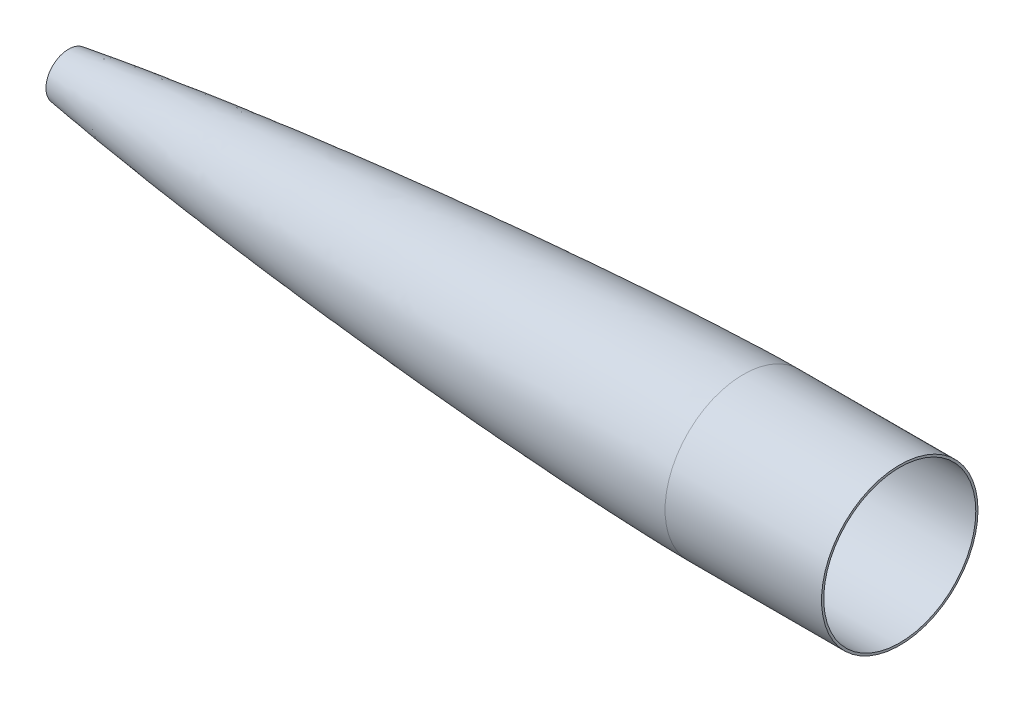
ISO-10303-21;
HEADER;
FILE_DESCRIPTION(('STEP AP214'),'2;1');
FILE_NAME('part.step','',(''),(''),'','','');
FILE_SCHEMA(('AUTOMOTIVE_DESIGN { 1 0 10303 214 1 1 1 1 }'));
ENDSEC;
DATA;
#1=APPLICATION_CONTEXT('core data for automotive mechanical design processes');
#2=APPLICATION_PROTOCOL_DEFINITION('international standard','automotive_design',2000,#1);
#3=PRODUCT_CONTEXT('',#1,'mechanical');
#4=PRODUCT('Part','Part','',(#3));
#5=PRODUCT_RELATED_PRODUCT_CATEGORY('part','',(#4));
#6=PRODUCT_DEFINITION_FORMATION('','',#4);
#7=PRODUCT_DEFINITION_CONTEXT('part definition',#1,'design');
#8=PRODUCT_DEFINITION('design','',#6,#7);
#9=PRODUCT_DEFINITION_SHAPE('','',#8);
#10=(LENGTH_UNIT() NAMED_UNIT(*) SI_UNIT(.MILLI.,.METRE.));
#11=(NAMED_UNIT(*) PLANE_ANGLE_UNIT() SI_UNIT($,.RADIAN.));
#12=(NAMED_UNIT(*) SI_UNIT($,.STERADIAN.) SOLID_ANGLE_UNIT());
#13=UNCERTAINTY_MEASURE_WITH_UNIT(LENGTH_MEASURE(1.E-05),#10,'distance_accuracy_value','');
#14=(GEOMETRIC_REPRESENTATION_CONTEXT(3) GLOBAL_UNCERTAINTY_ASSIGNED_CONTEXT((#13)) GLOBAL_UNIT_ASSIGNED_CONTEXT((#10,
#11,#12)) REPRESENTATION_CONTEXT('',''));
#15=CARTESIAN_POINT('',(0.,0.,0.));
#16=DIRECTION('',(0.,0.,1.));
#17=DIRECTION('',(1.,0.,0.));
#18=AXIS2_PLACEMENT_3D('',#15,#16,#17);
#19=CARTESIAN_POINT('',(104.775,0.,0.));
#20=DIRECTION('',(1.,0.,0.));
#21=DIRECTION('',(0.,0.,-1.));
#22=AXIS2_PLACEMENT_3D('',#19,#20,#21);
#23=PLANE('',#22);
#24=CARTESIAN_POINT('',(104.775,0.,0.));
#25=DIRECTION('',(1.,0.,0.));
#26=DIRECTION('',(0.,0.,-1.));
#27=AXIS2_PLACEMENT_3D('',#24,#25,#26);
#28=CIRCLE('',#27,21.9387077049308);
#29=CARTESIAN_POINT('',(104.775,0.,-21.9387077049308));
#30=VERTEX_POINT('',#29);
#31=EDGE_CURVE('E47',#30,#30,#28,.F.);
#32=ORIENTED_EDGE('',*,*,#31,.T.);
#33=EDGE_LOOP('',(#32));
#34=FACE_BOUND('',#33,.T.);
#35=CARTESIAN_POINT('',(104.775,0.,0.));
#36=DIRECTION('',(1.,0.,0.));
#37=DIRECTION('',(0.,0.,-1.));
#38=AXIS2_PLACEMENT_3D('',#35,#36,#37);
#39=CIRCLE('',#38,19.7550015977092);
#40=CARTESIAN_POINT('',(104.775,0.,-19.7550015977092));
#41=VERTEX_POINT('',#40);
#42=EDGE_CURVE('E11',#41,#41,#39,.T.);
#43=ORIENTED_EDGE('',*,*,#42,.T.);
#44=EDGE_LOOP('',(#43));
#45=FACE_BOUND('',#44,.T.);
#46=ADVANCED_FACE('F44',(#34,#45),#23,.F.);
#47=CARTESIAN_POINT('',(914.4,76.1999999999992,0.));
#48=DIRECTION('',(1.,0.,0.));
#49=DIRECTION('',(0.,0.,-1.));
#50=AXIS2_PLACEMENT_3D('',#47,#48,#49);
#51=PLANE('',#50);
#52=CARTESIAN_POINT('',(914.4,0.,0.));
#53=DIRECTION('',(1.,0.,0.));
#54=DIRECTION('',(0.,0.,-1.));
#55=AXIS2_PLACEMENT_3D('',#52,#53,#54);
#56=CIRCLE('',#55,76.1999999999992);
#57=CARTESIAN_POINT('',(914.4,0.,-76.1999999999992));
#58=VERTEX_POINT('',#57);
#59=EDGE_CURVE('E56',#58,#58,#56,.T.);
#60=ORIENTED_EDGE('',*,*,#59,.T.);
#61=EDGE_LOOP('',(#60));
#62=FACE_BOUND('',#61,.T.);
#63=CARTESIAN_POINT('',(914.4,0.,0.));
#64=DIRECTION('',(1.,0.,0.));
#65=DIRECTION('',(0.,0.,-1.));
#66=AXIS2_PLACEMENT_3D('',#63,#64,#65);
#67=CIRCLE('',#66,74.0409999999992);
#68=CARTESIAN_POINT('',(914.4,0.,-74.0409999999992));
#69=VERTEX_POINT('',#68);
#70=EDGE_CURVE('E66',#69,#69,#67,.T.);
#71=ORIENTED_EDGE('',*,*,#70,.F.);
#72=EDGE_LOOP('',(#71));
#73=FACE_BOUND('',#72,.T.);
#74=ADVANCED_FACE('F93',(#62,#73),#51,.T.);
#75=CARTESIAN_POINT('',(960.221076640723,0.,0.));
#76=DIRECTION('',(1.,0.,0.));
#77=DIRECTION('',(0.,0.,-1.));
#78=AXIS2_PLACEMENT_3D('',#75,#76,#77);
#79=CYLINDRICAL_SURFACE('',#78,74.041003336691);
#80=ORIENTED_EDGE('',*,*,#70,.T.);
#81=EDGE_LOOP('',(#80));
#82=FACE_BOUND('',#81,.T.);
#83=CARTESIAN_POINT('',(762.005368018504,0.,0.));
#84=DIRECTION('',(1.,0.,0.));
#85=DIRECTION('',(0.,0.,-1.));
#86=AXIS2_PLACEMENT_3D('',#83,#84,#85);
#87=CIRCLE('',#86,74.0410066733829);
#88=CARTESIAN_POINT('',(762.005368018504,0.,-74.0410066733829));
#89=VERTEX_POINT('',#88);
#90=EDGE_CURVE('E63',#89,#89,#87,.T.);
#91=ORIENTED_EDGE('',*,*,#90,.F.);
#92=EDGE_LOOP('',(#91));
#93=FACE_BOUND('',#92,.T.);
#94=ADVANCED_FACE('F85',(#82,#93),#79,.F.);
#95=CARTESIAN_POINT('',(1.5966894208912,-1.4532253415125,0.));
#96=CARTESIAN_POINT('',(1.66644635238767,-1.40951769027705,0.));
#97=CARTESIAN_POINT('',(1.7979675794761,-1.33394385201512,0.));
#98=CARTESIAN_POINT('',(2.15939487850161,-1.14515539439852,0.));
#99=CARTESIAN_POINT('',(2.65189246738067,-0.916387997042371,0.));
#100=CARTESIAN_POINT('',(3.28601352888347,-0.647665119239606,0.));
#101=CARTESIAN_POINT('',(4.01147600948078,-0.361170256568777,0.));
#102=CARTESIAN_POINT('',(4.6435276402426,-0.126986577472591,0.));
#103=CARTESIAN_POINT('',(5.11319654369267,0.040351078951649,0.));
#104=CARTESIAN_POINT('',(5.7203240713591,0.253376397494738,0.));
#105=CARTESIAN_POINT('',(7.13811270465795,0.730448768321977,0.));
#106=CARTESIAN_POINT('',(9.45930832429742,1.44654050115038,0.));
#107=CARTESIAN_POINT('',(13.2491142780115,2.52456618777661,0.));
#108=CARTESIAN_POINT('',(18.0389155580935,3.76569876022393,0.));
#109=CARTESIAN_POINT('',(23.8306649630417,5.14771323940779,0.));
#110=CARTESIAN_POINT('',(29.648590527165,6.44863176147,0.));
#111=CARTESIAN_POINT('',(37.4330011110395,8.09932424882299,0.));
#112=CARTESIAN_POINT('',(47.1977011757527,10.0379490965308,0.));
#113=CARTESIAN_POINT('',(58.9514350221575,12.2170784132277,0.));
#114=CARTESIAN_POINT('',(70.7304499973708,14.2838350200873,0.));
#115=CARTESIAN_POINT('',(82.5281465269336,16.2571787675086,0.));
#116=CARTESIAN_POINT('',(98.2792142953631,18.7820924753858,0.));
#117=CARTESIAN_POINT('',(117.999005521246,21.7696178871089,0.));
#118=CARTESIAN_POINT('',(141.697548840994,25.1413654288479,0.));
#119=CARTESIAN_POINT('',(165.423748420629,28.3342238150185,0.));
#120=CARTESIAN_POINT('',(197.088096381432,32.3864557888389,0.));
#121=CARTESIAN_POINT('',(236.714011752045,37.1143456589502,0.));
#122=CARTESIAN_POINT('',(284.319409266139,42.3403601120109,0.));
#123=CARTESIAN_POINT('',(331.968071588237,47.1742602653987,0.));
#124=CARTESIAN_POINT('',(379.65294245738,51.6492752206863,0.));
#125=CARTESIAN_POINT('',(427.36899667209,55.7854755115045,0.));
#126=CARTESIAN_POINT('',(491.0273413031,60.8585765565189,0.));
#127=CARTESIAN_POINT('',(554.735623652258,65.2733389905129,0.));
#128=CARTESIAN_POINT('',(618.486238067874,68.9559357953132,0.));
#129=CARTESIAN_POINT('',(658.346812288991,70.9123179197056,0.));
#130=CARTESIAN_POINT('',(690.243343800103,72.2264893205263,0.));
#131=CARTESIAN_POINT('',(714.169922879332,73.064630219583,0.));
#132=CARTESIAN_POINT('',(734.107419195309,73.6175534481716,0.));
#133=CARTESIAN_POINT('',(750.061548456621,73.9267165351704,0.));
#134=CARTESIAN_POINT('',(758.022543604084,74.0311039678526,0.));
#135=CARTESIAN_POINT('',(762.005368018504,74.0410066733829,0.));
#136=B_SPLINE_CURVE_WITH_KNOTS('',3,(#95,#96,#97,#98,#99,#100,#101,#102,#103,#104,#105,#106,
#107,#108,#109,#110,#111,#112,#113,#114,#115,#116,#117,#118,#119,#120,#121,#122,#123,#124,#125,
#126,#127,#128,#129,#130,#131,#132,#133,#134,#135),.UNSPECIFIED.,.F.,.F.,(4,1,1,1,1,1,1,1,1,1,1,
1,1,1,1,1,1,1,1,1,1,1,1,1,1,1,1,1,1,1,1,1,1,1,1,1,1,1,4),(0.000772313321282749,
0.00126021746516884,0.00174812160905493,0.00272392989682712,0.0036997381845993,
0.00467554647237149,0.00597077919186904,0.00645868333575513,0.00670263540769818,
0.00857877962346023,0.012482012774549,0.0163852459256377,0.0241917122278152,0.0319981785299927,
0.0398046448321701,0.0476111111343476,0.0632240437387026,0.0788369763430575,0.0944499089474125,
0.110062841551767,0.125675774156122,0.156901639364832,0.188127504573542,0.219353369782252,
0.250579234990962,0.313030965408382,0.375482695825802,0.437934426243222,0.500386156660641,
0.562837887078061,0.625289617495481,0.750193078330321,0.81264480874774,0.87509653916516,
0.90632240437387,0.93754826958258,0.96877413479129,0.984387067395645,1.),.UNSPECIFIED.);
#137=CARTESIAN_POINT('',(960.221076640723,0.,0.));
#138=DIRECTION('',(1.,0.,0.));
#139=AXIS1_PLACEMENT('',#137,#138);
#140=SURFACE_OF_REVOLUTION('',#136,#139);
#141=ORIENTED_EDGE('',*,*,#42,.F.);
#142=EDGE_LOOP('',(#141));
#143=FACE_BOUND('',#142,.T.);
#144=ORIENTED_EDGE('',*,*,#90,.T.);
#145=EDGE_LOOP('',(#144));
#146=FACE_BOUND('',#145,.T.);
#147=ADVANCED_FACE('F80',(#143,#146),#140,.F.);
#148=CARTESIAN_POINT('',(960.221076640723,0.,0.));
#149=DIRECTION('',(1.,0.,0.));
#150=DIRECTION('',(0.,0.,-1.));
#151=AXIS2_PLACEMENT_3D('',#148,#149,#150);
#152=CYLINDRICAL_SURFACE('',#151,76.1999999999996);
#153=CARTESIAN_POINT('',(762.,0.,0.));
#154=DIRECTION('',(1.,0.,0.));
#155=DIRECTION('',(0.,0.,-1.));
#156=AXIS2_PLACEMENT_3D('',#153,#154,#155);
#157=CIRCLE('',#156,76.2);
#158=CARTESIAN_POINT('',(762.,0.,-76.2));
#159=VERTEX_POINT('',#158);
#160=EDGE_CURVE('E60',#159,#159,#157,.T.);
#161=ORIENTED_EDGE('',*,*,#160,.T.);
#162=EDGE_LOOP('',(#161));
#163=FACE_BOUND('',#162,.T.);
#164=ORIENTED_EDGE('',*,*,#59,.F.);
#165=EDGE_LOOP('',(#164));
#166=FACE_BOUND('',#165,.T.);
#167=ADVANCED_FACE('F84',(#163,#166),#152,.T.);
#168=CARTESIAN_POINT('',(762.,76.2,0.));
#169=CARTESIAN_POINT('',(759.535680712392,76.1938728335225,0.));
#170=CARTESIAN_POINT('',(754.607214629949,76.1472025210852,0.));
#171=CARTESIAN_POINT('',(744.75096365725,76.0009236969158,0.));
#172=CARTESIAN_POINT('',(729.008940191205,75.6493473902044,0.));
#173=CARTESIAN_POINT('',(709.846968802492,75.0890680863509,0.));
#174=CARTESIAN_POINT('',(681.382453133294,74.0649049624754,0.));
#175=CARTESIAN_POINT('',(646.084739159712,72.5193621142089,0.));
#176=CARTESIAN_POINT('',(604.919686876544,70.3882688994821,0.));
#177=CARTESIAN_POINT('',(557.895516644441,67.5683159172448,0.));
#178=CARTESIAN_POINT('',(510.893551418993,64.4006623146469,0.));
#179=CARTESIAN_POINT('',(463.914878093252,60.9050277005765,0.));
#180=CARTESIAN_POINT('',(416.961053131877,57.0900660242171,0.));
#181=CARTESIAN_POINT('',(370.034377395524,52.9546100227391,0.));
#182=CARTESIAN_POINT('',(323.137908500437,48.48890289006,0.));
#183=CARTESIAN_POINT('',(276.276229385446,43.6716554210397,0.));
#184=CARTESIAN_POINT('',(229.455566620542,38.4690226296388,0.));
#185=CARTESIAN_POINT('',(182.686162168429,32.82335487334,0.));
#186=CARTESIAN_POINT('',(135.983522597674,26.6446576507431,0.));
#187=CARTESIAN_POINT('',(93.9880000366202,20.4428178295019,0.));
#188=CARTESIAN_POINT('',(59.3411597014792,14.6384056605633,0.));
#189=CARTESIAN_POINT('',(34.1072221260699,9.71834894907394,0.));
#190=CARTESIAN_POINT('',(19.2549614824768,6.35203331631896,0.));
#191=CARTESIAN_POINT('',(10.7438223533601,4.10257575573642,0.));
#192=CARTESIAN_POINT('',(6.209256823887,2.71726793016541,0.));
#193=CARTESIAN_POINT('',(3.74182799157067,1.85585535162009,0.));
#194=CARTESIAN_POINT('',(2.37241154517901,1.31686063430997,0.));
#195=CARTESIAN_POINT('',(1.60684838074994,0.981571373028889,0.));
#196=CARTESIAN_POINT('',(1.15585698102857,0.765404136224999,0.));
#197=CARTESIAN_POINT('',(0.865193662031819,0.615317029757066,0.));
#198=CARTESIAN_POINT('',(0.665535864358104,0.506037908155194,0.));
#199=CARTESIAN_POINT('',(0.4916855089662,0.403755038969035,0.));
#200=CARTESIAN_POINT('',(0.343572961620863,0.308976356735951,0.));
#201=CARTESIAN_POINT('',(0.220279687535845,0.221830422065781,0.));
#202=CARTESIAN_POINT('',(0.133531263927965,0.153441603057387,0.));
#203=CARTESIAN_POINT('',(0.0695139576385107,0.0948397750224905,0.));
#204=CARTESIAN_POINT('',(0.0272884786280436,0.0477751906480358,0.));
#205=CARTESIAN_POINT('',(0.00925440290793555,0.0217984592264425,0.));
#206=CARTESIAN_POINT('',(0.00270395090681571,0.00747540324014918,0.));
#207=CARTESIAN_POINT('',(0.,0.,0.));
#208=B_SPLINE_CURVE_WITH_KNOTS('',4,(#168,#169,#170,#171,#172,#173,#174,#175,#176,#177,#178,
#179,#180,#181,#182,#183,#184,#185,#186,#187,#188,#189,#190,#191,#192,#193,#194,#195,#196,#197,
#198,#199,#200,#201,#202,#203,#204,#205,#206,#207),.UNSPECIFIED.,.F.,.F.,(5,1,1,1,1,1,1,1,1,1,1,
1,1,1,1,1,1,1,1,1,1,1,1,1,1,1,1,1,1,1,1,1,1,1,1,1,5),(0.,0.0128492358117218,0.0256984716234437,
0.0513969432468875,0.0821003608522829,0.112803778457678,0.174210614147341,0.235617448586372,
0.297024283717592,0.358431119418529,0.419837954270915,0.481244788848652,0.542651623684503,
0.604058458651424,0.665465293578799,0.72687212820512,0.788278962131133,0.84968579513248,
0.911092633730081,0.948206196227928,0.971430996398699,0.98371923647716,0.990484137478658,
0.99409832301046,0.99614747953197,0.997342942804025,0.998155751267515,0.998455208251285,
0.998754665235056,0.999048506387141,0.999342347539226,0.999506760654419,0.999671173769613,
0.999835586884806,0.999917793442403,0.999958896721202,1.),.UNSPECIFIED.);
#209=CARTESIAN_POINT('',(960.221076640723,0.,0.));
#210=DIRECTION('',(1.,0.,0.));
#211=AXIS1_PLACEMENT('',#209,#210);
#212=SURFACE_OF_REVOLUTION('',#208,#211);
#213=ORIENTED_EDGE('',*,*,#31,.F.);
#214=EDGE_LOOP('',(#213));
#215=FACE_BOUND('',#214,.T.);
#216=ORIENTED_EDGE('',*,*,#160,.F.);
#217=EDGE_LOOP('',(#216));
#218=FACE_BOUND('',#217,.T.);
#219=ADVANCED_FACE('F87',(#215,#218),#212,.F.);
#220=CLOSED_SHELL('',(#46,#74,#94,#147,#167,#219));
#221=MANIFOLD_SOLID_BREP('B2',#220);
#222=ADVANCED_BREP_SHAPE_REPRESENTATION('',(#18,#221),#14);
#223=SHAPE_DEFINITION_REPRESENTATION(#9,#222);
ENDSEC;
END-ISO-10303-21;
